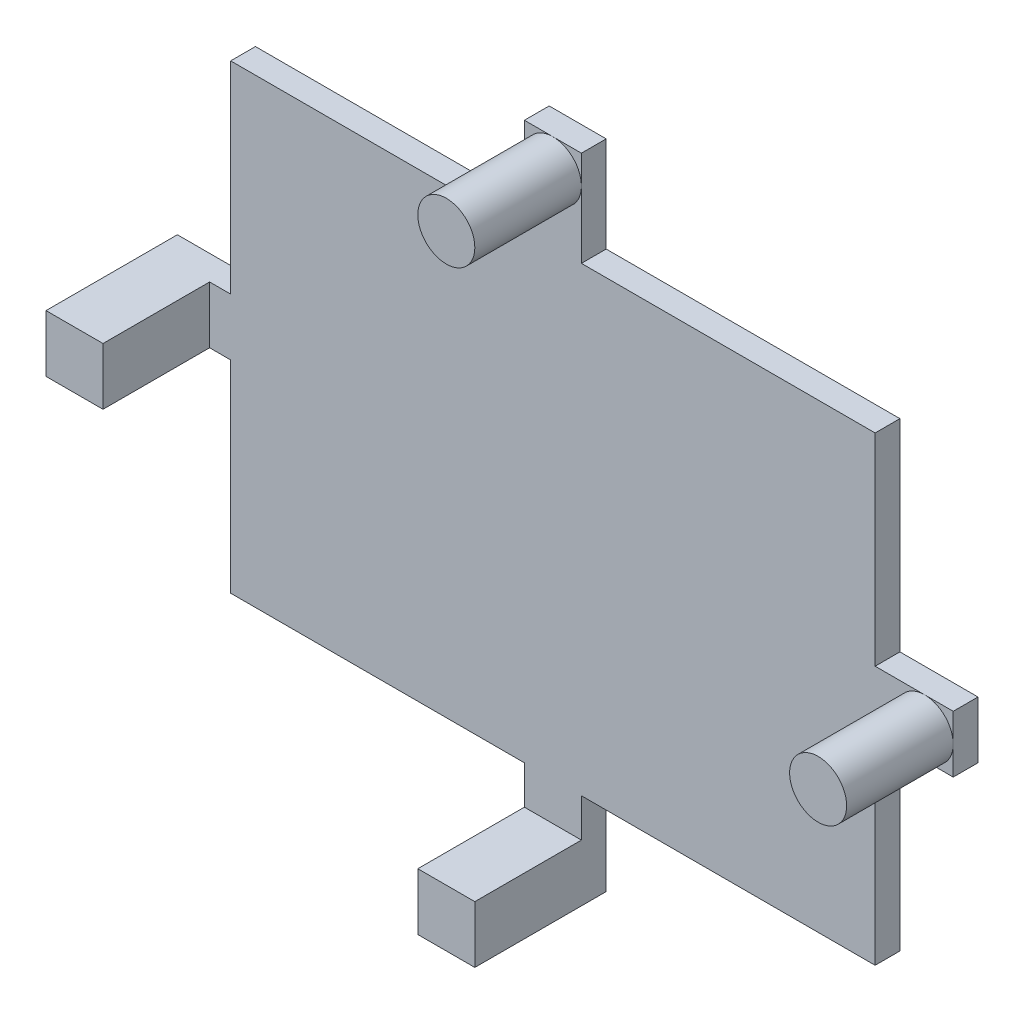
ISO-10303-21;
HEADER;
FILE_DESCRIPTION(('STEP AP214'),'2;1');
FILE_NAME('part.step','',(''),(''),'','','');
FILE_SCHEMA(('AUTOMOTIVE_DESIGN { 1 0 10303 214 1 1 1 1 }'));
ENDSEC;
DATA;
#1=APPLICATION_CONTEXT('core data for automotive mechanical design processes');
#2=APPLICATION_PROTOCOL_DEFINITION('international standard','automotive_design',2000,#1);
#3=PRODUCT_CONTEXT('',#1,'mechanical');
#4=PRODUCT('Part','Part','',(#3));
#5=PRODUCT_RELATED_PRODUCT_CATEGORY('part','',(#4));
#6=PRODUCT_DEFINITION_FORMATION('','',#4);
#7=PRODUCT_DEFINITION_CONTEXT('part definition',#1,'design');
#8=PRODUCT_DEFINITION('design','',#6,#7);
#9=PRODUCT_DEFINITION_SHAPE('','',#8);
#10=(LENGTH_UNIT() NAMED_UNIT(*) SI_UNIT(.MILLI.,.METRE.));
#11=(NAMED_UNIT(*) PLANE_ANGLE_UNIT() SI_UNIT($,.RADIAN.));
#12=(NAMED_UNIT(*) SI_UNIT($,.STERADIAN.) SOLID_ANGLE_UNIT());
#13=UNCERTAINTY_MEASURE_WITH_UNIT(LENGTH_MEASURE(1.E-05),#10,'distance_accuracy_value','');
#14=(GEOMETRIC_REPRESENTATION_CONTEXT(3) GLOBAL_UNCERTAINTY_ASSIGNED_CONTEXT((#13)) GLOBAL_UNIT_ASSIGNED_CONTEXT((#10,
#11,#12)) REPRESENTATION_CONTEXT('',''));
#15=CARTESIAN_POINT('',(0.,0.,0.));
#16=DIRECTION('',(0.,0.,1.));
#17=DIRECTION('',(1.,0.,0.));
#18=AXIS2_PLACEMENT_3D('',#15,#16,#17);
#19=CARTESIAN_POINT('',(-65.,-46.5,5.));
#20=DIRECTION('',(1.,0.,0.));
#21=DIRECTION('',(0.,0.,-1.));
#22=AXIS2_PLACEMENT_3D('',#19,#20,#21);
#23=PLANE('',#22);
#24=DIRECTION('',(0.,0.,-1.));
#25=VECTOR('',#24,1.);
#26=CARTESIAN_POINT('',(-65.,5.74999999999999,27.4234809964912));
#27=LINE('',#26,#25);
#28=CARTESIAN_POINT('',(-65.,5.74999999999998,5.));
#29=VERTEX_POINT('',#28);
#30=CARTESIAN_POINT('',(-65.,5.74999999999999,0.));
#31=VERTEX_POINT('',#30);
#32=EDGE_CURVE('E68',#29,#31,#27,.T.);
#33=ORIENTED_EDGE('',*,*,#32,.F.);
#34=DIRECTION('',(0.,-1.,0.));
#35=VECTOR('',#34,1.);
#36=CARTESIAN_POINT('',(-65.,-46.5,5.));
#37=LINE('',#36,#35);
#38=CARTESIAN_POINT('',(-65.,46.5,5.));
#39=VERTEX_POINT('',#38);
#40=EDGE_CURVE('E434',#39,#29,#37,.T.);
#41=ORIENTED_EDGE('',*,*,#40,.F.);
#42=DIRECTION('',(0.,0.,-1.));
#43=VECTOR('',#42,1.);
#44=CARTESIAN_POINT('',(-65.,46.5,5.));
#45=LINE('',#44,#43);
#46=CARTESIAN_POINT('',(-65.,46.5,0.));
#47=VERTEX_POINT('',#46);
#48=EDGE_CURVE('E464',#39,#47,#45,.T.);
#49=ORIENTED_EDGE('',*,*,#48,.T.);
#50=DIRECTION('',(0.,-1.,0.));
#51=VECTOR('',#50,1.);
#52=CARTESIAN_POINT('',(-65.,-46.5,0.));
#53=LINE('',#52,#51);
#54=EDGE_CURVE('E451',#47,#31,#53,.T.);
#55=ORIENTED_EDGE('',*,*,#54,.T.);
#56=EDGE_LOOP('',(#33,#41,#49,#55));
#57=FACE_BOUND('',#56,.T.);
#58=ADVANCED_FACE('F41',(#57),#23,.F.);
#59=CARTESIAN_POINT('',(-65.,-46.5,5.));
#60=DIRECTION('',(0.,1.,0.));
#61=DIRECTION('',(0.,0.,1.));
#62=AXIS2_PLACEMENT_3D('',#59,#60,#61);
#63=PLANE('',#62);
#64=DIRECTION('',(0.,0.,-1.));
#65=VECTOR('',#64,1.);
#66=CARTESIAN_POINT('',(-5.74999999999999,-46.5,27.4234809964912));
#67=LINE('',#66,#65);
#68=CARTESIAN_POINT('',(-5.74999999999999,-46.5,5.));
#69=VERTEX_POINT('',#68);
#70=CARTESIAN_POINT('',(-5.74999999999999,-46.5,0.));
#71=VERTEX_POINT('',#70);
#72=EDGE_CURVE('E282',#69,#71,#67,.T.);
#73=ORIENTED_EDGE('',*,*,#72,.F.);
#74=DIRECTION('',(1.,0.,0.));
#75=VECTOR('',#74,1.);
#76=CARTESIAN_POINT('',(-65.,-46.5,5.));
#77=LINE('',#76,#75);
#78=CARTESIAN_POINT('',(-65.,-46.5,5.));
#79=VERTEX_POINT('',#78);
#80=EDGE_CURVE('E438',#79,#69,#77,.T.);
#81=ORIENTED_EDGE('',*,*,#80,.F.);
#82=DIRECTION('',(0.,0.,-1.));
#83=VECTOR('',#82,1.);
#84=CARTESIAN_POINT('',(-65.,-46.5,5.));
#85=LINE('',#84,#83);
#86=CARTESIAN_POINT('',(-65.,-46.5,0.));
#87=VERTEX_POINT('',#86);
#88=EDGE_CURVE('E461',#79,#87,#85,.T.);
#89=ORIENTED_EDGE('',*,*,#88,.T.);
#90=DIRECTION('',(1.,0.,0.));
#91=VECTOR('',#90,1.);
#92=CARTESIAN_POINT('',(-65.,-46.5,0.));
#93=LINE('',#92,#91);
#94=EDGE_CURVE('E455',#87,#71,#93,.T.);
#95=ORIENTED_EDGE('',*,*,#94,.T.);
#96=EDGE_LOOP('',(#73,#81,#89,#95));
#97=FACE_BOUND('',#96,.T.);
#98=ADVANCED_FACE('F547',(#97),#63,.F.);
#99=CARTESIAN_POINT('',(0.,0.,5.));
#100=DIRECTION('',(0.,0.,-1.));
#101=DIRECTION('',(-1.,0.,0.));
#102=AXIS2_PLACEMENT_3D('',#99,#100,#101);
#103=PLANE('',#102);
#104=CARTESIAN_POINT('',(75.,0.,5.));
#105=DIRECTION('',(0.,0.,1.));
#106=DIRECTION('',(1.,0.,0.));
#107=AXIS2_PLACEMENT_3D('',#104,#105,#106);
#108=CIRCLE('',#107,5.74999999999999);
#109=CARTESIAN_POINT('',(75.,-5.74999999999999,5.));
#110=VERTEX_POINT('',#109);
#111=CARTESIAN_POINT('',(80.75,0.,5.));
#112=VERTEX_POINT('',#111);
#113=EDGE_CURVE('E336',#110,#112,#108,.T.);
#114=ORIENTED_EDGE('',*,*,#113,.F.);
#115=DIRECTION('',(-1.,0.,0.));
#116=VECTOR('',#115,1.);
#117=CARTESIAN_POINT('',(0.,-5.74999999999999,5.));
#118=LINE('',#117,#116);
#119=CARTESIAN_POINT('',(80.75,-5.74999999999999,5.));
#120=VERTEX_POINT('',#119);
#121=EDGE_CURVE('E355',#120,#110,#118,.T.);
#122=ORIENTED_EDGE('',*,*,#121,.F.);
#123=DIRECTION('',(0.,1.,0.));
#124=VECTOR('',#123,1.);
#125=CARTESIAN_POINT('',(80.75,0.,5.));
#126=LINE('',#125,#124);
#127=EDGE_CURVE('E365',#120,#112,#126,.T.);
#128=ORIENTED_EDGE('',*,*,#127,.T.);
#129=EDGE_LOOP('',(#114,#122,#128));
#130=FACE_BOUND('',#129,.T.);
#131=ADVANCED_FACE('F520',(#130),#103,.F.);
#132=CARTESIAN_POINT('',(75.,5.74999999999999,5.));
#133=VERTEX_POINT('',#132);
#134=EDGE_CURVE('E330',#112,#133,#108,.T.);
#135=ORIENTED_EDGE('',*,*,#134,.F.);
#136=CARTESIAN_POINT('',(80.75,5.74999999999999,5.));
#137=VERTEX_POINT('',#136);
#138=EDGE_CURVE('E344',#112,#137,#126,.T.);
#139=ORIENTED_EDGE('',*,*,#138,.T.);
#140=DIRECTION('',(-1.,0.,0.));
#141=VECTOR('',#140,1.);
#142=CARTESIAN_POINT('',(0.,5.74999999999999,5.));
#143=LINE('',#142,#141);
#144=EDGE_CURVE('E360',#137,#133,#143,.T.);
#145=ORIENTED_EDGE('',*,*,#144,.T.);
#146=EDGE_LOOP('',(#135,#139,#145));
#147=FACE_BOUND('',#146,.T.);
#148=ADVANCED_FACE('F529',(#147),#103,.F.);
#149=CARTESIAN_POINT('',(65.,-46.5,5.));
#150=DIRECTION('',(-1.,0.,0.));
#151=DIRECTION('',(0.,0.,1.));
#152=AXIS2_PLACEMENT_3D('',#149,#150,#151);
#153=PLANE('',#152);
#154=DIRECTION('',(0.,0.,-1.));
#155=VECTOR('',#154,1.);
#156=CARTESIAN_POINT('',(65.,-5.74999999999999,27.4234809964912));
#157=LINE('',#156,#155);
#158=CARTESIAN_POINT('',(65.,-5.75000000000001,5.));
#159=VERTEX_POINT('',#158);
#160=CARTESIAN_POINT('',(65.,-5.74999999999999,0.));
#161=VERTEX_POINT('',#160);
#162=EDGE_CURVE('E358',#159,#161,#157,.T.);
#163=ORIENTED_EDGE('',*,*,#162,.F.);
#164=DIRECTION('',(0.,1.,0.));
#165=VECTOR('',#164,1.);
#166=CARTESIAN_POINT('',(65.,-46.5,5.));
#167=LINE('',#166,#165);
#168=CARTESIAN_POINT('',(65.,-46.5,5.));
#169=VERTEX_POINT('',#168);
#170=EDGE_CURVE('E424',#169,#159,#167,.T.);
#171=ORIENTED_EDGE('',*,*,#170,.F.);
#172=DIRECTION('',(0.,0.,-1.));
#173=VECTOR('',#172,1.);
#174=CARTESIAN_POINT('',(65.,-46.5,5.));
#175=LINE('',#174,#173);
#176=CARTESIAN_POINT('',(65.,-46.5,0.));
#177=VERTEX_POINT('',#176);
#178=EDGE_CURVE('E442',#169,#177,#175,.T.);
#179=ORIENTED_EDGE('',*,*,#178,.T.);
#180=DIRECTION('',(0.,1.,0.));
#181=VECTOR('',#180,1.);
#182=CARTESIAN_POINT('',(65.,-46.5,0.));
#183=LINE('',#182,#181);
#184=EDGE_CURVE('E443',#177,#161,#183,.T.);
#185=ORIENTED_EDGE('',*,*,#184,.T.);
#186=EDGE_LOOP('',(#163,#171,#179,#185));
#187=FACE_BOUND('',#186,.T.);
#188=ADVANCED_FACE('F574',(#187),#153,.F.);
#189=CARTESIAN_POINT('',(0.,60.,5.));
#190=DIRECTION('',(0.,0.,1.));
#191=DIRECTION('',(1.,0.,0.));
#192=AXIS2_PLACEMENT_3D('',#189,#190,#191);
#193=CIRCLE('',#192,5.75);
#194=CARTESIAN_POINT('',(5.75,60.,5.));
#195=VERTEX_POINT('',#194);
#196=CARTESIAN_POINT('',(0.,65.75,5.));
#197=VERTEX_POINT('',#196);
#198=EDGE_CURVE('E53',#195,#197,#193,.T.);
#199=ORIENTED_EDGE('',*,*,#198,.F.);
#200=DIRECTION('',(0.,-1.,0.));
#201=VECTOR('',#200,1.);
#202=CARTESIAN_POINT('',(5.75000000000002,0.,5.));
#203=LINE('',#202,#201);
#204=CARTESIAN_POINT('',(5.75000000000002,65.75,5.));
#205=VERTEX_POINT('',#204);
#206=EDGE_CURVE('E400',#205,#195,#203,.T.);
#207=ORIENTED_EDGE('',*,*,#206,.F.);
#208=DIRECTION('',(-1.,0.,0.));
#209=VECTOR('',#208,1.);
#210=CARTESIAN_POINT('',(0.,65.75,5.));
#211=LINE('',#210,#209);
#212=EDGE_CURVE('E411',#205,#197,#211,.T.);
#213=ORIENTED_EDGE('',*,*,#212,.T.);
#214=EDGE_LOOP('',(#199,#207,#213));
#215=FACE_BOUND('',#214,.T.);
#216=ADVANCED_FACE('F579',(#215),#103,.F.);
#217=CARTESIAN_POINT('',(-5.74999999999999,60.,5.));
#218=VERTEX_POINT('',#217);
#219=EDGE_CURVE('E11',#197,#218,#193,.T.);
#220=ORIENTED_EDGE('',*,*,#219,.F.);
#221=CARTESIAN_POINT('',(-5.74999999999999,65.75,5.));
#222=VERTEX_POINT('',#221);
#223=EDGE_CURVE('E389',#197,#222,#211,.T.);
#224=ORIENTED_EDGE('',*,*,#223,.T.);
#225=DIRECTION('',(0.,-1.,0.));
#226=VECTOR('',#225,1.);
#227=CARTESIAN_POINT('',(-5.74999999999999,0.,5.));
#228=LINE('',#227,#226);
#229=EDGE_CURVE('E405',#222,#218,#228,.T.);
#230=ORIENTED_EDGE('',*,*,#229,.T.);
#231=EDGE_LOOP('',(#220,#224,#230));
#232=FACE_BOUND('',#231,.T.);
#233=ADVANCED_FACE('F488',(#232),#103,.F.);
#234=CARTESIAN_POINT('',(-65.,46.5,5.));
#235=DIRECTION('',(0.,-1.,0.));
#236=DIRECTION('',(0.,0.,-1.));
#237=AXIS2_PLACEMENT_3D('',#234,#235,#236);
#238=PLANE('',#237);
#239=DIRECTION('',(0.,0.,-1.));
#240=VECTOR('',#239,1.);
#241=CARTESIAN_POINT('',(5.75000000000002,46.5,27.4234809964912));
#242=LINE('',#241,#240);
#243=CARTESIAN_POINT('',(5.75000000000002,46.5,5.));
#244=VERTEX_POINT('',#243);
#245=CARTESIAN_POINT('',(5.75000000000002,46.5,0.));
#246=VERTEX_POINT('',#245);
#247=EDGE_CURVE('E403',#244,#246,#242,.T.);
#248=ORIENTED_EDGE('',*,*,#247,.F.);
#249=DIRECTION('',(-1.,0.,0.));
#250=VECTOR('',#249,1.);
#251=CARTESIAN_POINT('',(-65.,46.5,5.));
#252=LINE('',#251,#250);
#253=CARTESIAN_POINT('',(65.,46.5,5.));
#254=VERTEX_POINT('',#253);
#255=EDGE_CURVE('E430',#254,#244,#252,.T.);
#256=ORIENTED_EDGE('',*,*,#255,.F.);
#257=DIRECTION('',(0.,0.,-1.));
#258=VECTOR('',#257,1.);
#259=CARTESIAN_POINT('',(65.,46.5,5.));
#260=LINE('',#259,#258);
#261=CARTESIAN_POINT('',(65.,46.5,0.));
#262=VERTEX_POINT('',#261);
#263=EDGE_CURVE('E45',#254,#262,#260,.T.);
#264=ORIENTED_EDGE('',*,*,#263,.T.);
#265=DIRECTION('',(-1.,0.,0.));
#266=VECTOR('',#265,1.);
#267=CARTESIAN_POINT('',(-65.,46.5,0.));
#268=LINE('',#267,#266);
#269=EDGE_CURVE('E447',#262,#246,#268,.T.);
#270=ORIENTED_EDGE('',*,*,#269,.T.);
#271=EDGE_LOOP('',(#248,#256,#264,#270));
#272=FACE_BOUND('',#271,.T.);
#273=ADVANCED_FACE('F570',(#272),#238,.F.);
#274=CARTESIAN_POINT('',(65.,5.74999999999998,5.));
#275=VERTEX_POINT('',#274);
#276=EDGE_CURVE('E429',#275,#254,#167,.T.);
#277=ORIENTED_EDGE('',*,*,#276,.F.);
#278=DIRECTION('',(0.,0.,-1.));
#279=VECTOR('',#278,1.);
#280=CARTESIAN_POINT('',(65.,5.74999999999999,27.4234809964912));
#281=LINE('',#280,#279);
#282=CARTESIAN_POINT('',(65.,5.74999999999998,0.));
#283=VERTEX_POINT('',#282);
#284=EDGE_CURVE('E354',#275,#283,#281,.T.);
#285=ORIENTED_EDGE('',*,*,#284,.T.);
#286=EDGE_CURVE('E409',#283,#262,#183,.T.);
#287=ORIENTED_EDGE('',*,*,#286,.T.);
#288=ORIENTED_EDGE('',*,*,#263,.F.);
#289=EDGE_LOOP('',(#277,#285,#287,#288));
#290=FACE_BOUND('',#289,.T.);
#291=ADVANCED_FACE('F43',(#290),#153,.F.);
#292=CARTESIAN_POINT('',(-5.74999999999999,46.5,5.));
#293=VERTEX_POINT('',#292);
#294=EDGE_CURVE('E428',#293,#39,#252,.T.);
#295=ORIENTED_EDGE('',*,*,#294,.F.);
#296=DIRECTION('',(0.,0.,-1.));
#297=VECTOR('',#296,1.);
#298=CARTESIAN_POINT('',(-5.74999999999999,46.5,27.4234809964912));
#299=LINE('',#298,#297);
#300=CARTESIAN_POINT('',(-5.74999999999999,46.5,0.));
#301=VERTEX_POINT('',#300);
#302=EDGE_CURVE('E399',#293,#301,#299,.T.);
#303=ORIENTED_EDGE('',*,*,#302,.T.);
#304=EDGE_CURVE('E446',#301,#47,#268,.T.);
#305=ORIENTED_EDGE('',*,*,#304,.T.);
#306=ORIENTED_EDGE('',*,*,#48,.F.);
#307=EDGE_LOOP('',(#295,#303,#305,#306));
#308=FACE_BOUND('',#307,.T.);
#309=ADVANCED_FACE('F556',(#308),#238,.F.);
#310=CARTESIAN_POINT('',(-65.,-5.75000000000001,5.));
#311=VERTEX_POINT('',#310);
#312=EDGE_CURVE('E60',#311,#79,#37,.T.);
#313=ORIENTED_EDGE('',*,*,#312,.F.);
#314=DIRECTION('',(0.,0.,-1.));
#315=VECTOR('',#314,1.);
#316=CARTESIAN_POINT('',(-65.,-5.74999999999999,27.4234809964912));
#317=LINE('',#316,#315);
#318=CARTESIAN_POINT('',(-65.,-5.75000000000001,0.));
#319=VERTEX_POINT('',#318);
#320=EDGE_CURVE('E250',#311,#319,#317,.T.);
#321=ORIENTED_EDGE('',*,*,#320,.T.);
#322=EDGE_CURVE('E450',#319,#87,#53,.T.);
#323=ORIENTED_EDGE('',*,*,#322,.T.);
#324=ORIENTED_EDGE('',*,*,#88,.F.);
#325=EDGE_LOOP('',(#313,#321,#323,#324));
#326=FACE_BOUND('',#325,.T.);
#327=ADVANCED_FACE('F542',(#326),#23,.F.);
#328=CARTESIAN_POINT('',(5.75000000000002,-46.5,5.));
#329=VERTEX_POINT('',#328);
#330=EDGE_CURVE('E437',#329,#169,#77,.T.);
#331=ORIENTED_EDGE('',*,*,#330,.F.);
#332=DIRECTION('',(0.,0.,-1.));
#333=VECTOR('',#332,1.);
#334=CARTESIAN_POINT('',(5.75000000000002,-46.5,27.4234809964912));
#335=LINE('',#334,#333);
#336=CARTESIAN_POINT('',(5.75000000000002,-46.5,0.));
#337=VERTEX_POINT('',#336);
#338=EDGE_CURVE('E306',#329,#337,#335,.T.);
#339=ORIENTED_EDGE('',*,*,#338,.T.);
#340=EDGE_CURVE('E454',#337,#177,#93,.T.);
#341=ORIENTED_EDGE('',*,*,#340,.T.);
#342=ORIENTED_EDGE('',*,*,#178,.F.);
#343=EDGE_LOOP('',(#331,#339,#341,#342));
#344=FACE_BOUND('',#343,.T.);
#345=ADVANCED_FACE('F563',(#344),#63,.F.);
#346=DIRECTION('',(-1.,0.,0.));
#347=VECTOR('',#346,1.);
#348=CARTESIAN_POINT('',(0.,5.74999999999999,5.));
#349=LINE('',#348,#347);
#350=CARTESIAN_POINT('',(-69.25,5.74999999999999,5.));
#351=VERTEX_POINT('',#350);
#352=EDGE_CURVE('E244',#29,#351,#349,.T.);
#353=ORIENTED_EDGE('',*,*,#352,.T.);
#354=DIRECTION('',(0.,-1.,0.));
#355=VECTOR('',#354,1.);
#356=CARTESIAN_POINT('',(-69.25,5.74999999999999,5.));
#357=LINE('',#356,#355);
#358=CARTESIAN_POINT('',(-69.25,-5.75000000000001,5.));
#359=VERTEX_POINT('',#358);
#360=EDGE_CURVE('E229',#351,#359,#357,.T.);
#361=ORIENTED_EDGE('',*,*,#360,.T.);
#362=DIRECTION('',(-1.,0.,0.));
#363=VECTOR('',#362,1.);
#364=CARTESIAN_POINT('',(0.,-5.74999999999999,5.));
#365=LINE('',#364,#363);
#366=EDGE_CURVE('E241',#311,#359,#365,.T.);
#367=ORIENTED_EDGE('',*,*,#366,.F.);
#368=ORIENTED_EDGE('',*,*,#312,.T.);
#369=ORIENTED_EDGE('',*,*,#80,.T.);
#370=DIRECTION('',(0.,-1.,0.));
#371=VECTOR('',#370,1.);
#372=CARTESIAN_POINT('',(-5.74999999999999,0.,5.));
#373=LINE('',#372,#371);
#374=CARTESIAN_POINT('',(-5.74999999999999,-54.25,5.));
#375=VERTEX_POINT('',#374);
#376=EDGE_CURVE('E301',#69,#375,#373,.T.);
#377=ORIENTED_EDGE('',*,*,#376,.T.);
#378=DIRECTION('',(1.,0.,0.));
#379=VECTOR('',#378,1.);
#380=CARTESIAN_POINT('',(-5.74999999999999,-54.25,5.));
#381=LINE('',#380,#379);
#382=CARTESIAN_POINT('',(5.75000000000001,-54.25,5.));
#383=VERTEX_POINT('',#382);
#384=EDGE_CURVE('E278',#375,#383,#381,.T.);
#385=ORIENTED_EDGE('',*,*,#384,.T.);
#386=DIRECTION('',(0.,-1.,0.));
#387=VECTOR('',#386,1.);
#388=CARTESIAN_POINT('',(5.75000000000002,0.,5.));
#389=LINE('',#388,#387);
#390=EDGE_CURVE('E312',#329,#383,#389,.T.);
#391=ORIENTED_EDGE('',*,*,#390,.F.);
#392=ORIENTED_EDGE('',*,*,#330,.T.);
#393=ORIENTED_EDGE('',*,*,#170,.T.);
#394=EDGE_CURVE('E359',#110,#159,#118,.T.);
#395=ORIENTED_EDGE('',*,*,#394,.F.);
#396=EDGE_CURVE('E335',#133,#110,#108,.T.);
#397=ORIENTED_EDGE('',*,*,#396,.F.);
#398=EDGE_CURVE('E364',#133,#275,#143,.T.);
#399=ORIENTED_EDGE('',*,*,#398,.T.);
#400=ORIENTED_EDGE('',*,*,#276,.T.);
#401=ORIENTED_EDGE('',*,*,#255,.T.);
#402=EDGE_CURVE('E404',#195,#244,#203,.T.);
#403=ORIENTED_EDGE('',*,*,#402,.F.);
#404=EDGE_CURVE('E51',#218,#195,#193,.T.);
#405=ORIENTED_EDGE('',*,*,#404,.F.);
#406=EDGE_CURVE('E410',#218,#293,#228,.T.);
#407=ORIENTED_EDGE('',*,*,#406,.T.);
#408=ORIENTED_EDGE('',*,*,#294,.T.);
#409=ORIENTED_EDGE('',*,*,#40,.T.);
#410=EDGE_LOOP('',(#353,#361,#367,#368,#369,#377,#385,#391,#392,#393,#395,#397,#399,#400,#401,
#403,#405,#407,#408,#409));
#411=FACE_BOUND('',#410,.T.);
#412=ADVANCED_FACE('F240',(#411),#103,.F.);
#413=CARTESIAN_POINT('',(0.,0.,0.));
#414=DIRECTION('',(0.,0.,-1.));
#415=DIRECTION('',(-1.,0.,0.));
#416=AXIS2_PLACEMENT_3D('',#413,#414,#415);
#417=PLANE('',#416);
#418=ORIENTED_EDGE('',*,*,#184,.F.);
#419=ORIENTED_EDGE('',*,*,#340,.F.);
#420=DIRECTION('',(0.,-1.,0.));
#421=VECTOR('',#420,1.);
#422=CARTESIAN_POINT('',(5.75000000000002,0.,0.));
#423=LINE('',#422,#421);
#424=CARTESIAN_POINT('',(5.75000000000002,-65.75,0.));
#425=VERTEX_POINT('',#424);
#426=EDGE_CURVE('E302',#337,#425,#423,.T.);
#427=ORIENTED_EDGE('',*,*,#426,.T.);
#428=DIRECTION('',(-1.,0.,0.));
#429=VECTOR('',#428,1.);
#430=CARTESIAN_POINT('',(0.,-65.75,0.));
#431=LINE('',#430,#429);
#432=CARTESIAN_POINT('',(-5.74999999999999,-65.75,0.));
#433=VERTEX_POINT('',#432);
#434=EDGE_CURVE('E297',#425,#433,#431,.T.);
#435=ORIENTED_EDGE('',*,*,#434,.T.);
#436=DIRECTION('',(0.,-1.,0.));
#437=VECTOR('',#436,1.);
#438=CARTESIAN_POINT('',(-5.74999999999999,0.,0.));
#439=LINE('',#438,#437);
#440=EDGE_CURVE('E307',#71,#433,#439,.T.);
#441=ORIENTED_EDGE('',*,*,#440,.F.);
#442=ORIENTED_EDGE('',*,*,#94,.F.);
#443=ORIENTED_EDGE('',*,*,#322,.F.);
#444=DIRECTION('',(-1.,0.,0.));
#445=VECTOR('',#444,1.);
#446=CARTESIAN_POINT('',(0.,-5.74999999999999,0.));
#447=LINE('',#446,#445);
#448=CARTESIAN_POINT('',(-80.75,-5.74999999999999,0.));
#449=VERTEX_POINT('',#448);
#450=EDGE_CURVE('E262',#319,#449,#447,.T.);
#451=ORIENTED_EDGE('',*,*,#450,.T.);
#452=DIRECTION('',(0.,1.,0.));
#453=VECTOR('',#452,1.);
#454=CARTESIAN_POINT('',(-80.75,0.,0.));
#455=LINE('',#454,#453);
#456=CARTESIAN_POINT('',(-80.75,5.74999999999999,0.));
#457=VERTEX_POINT('',#456);
#458=EDGE_CURVE('E270',#449,#457,#455,.T.);
#459=ORIENTED_EDGE('',*,*,#458,.T.);
#460=DIRECTION('',(-1.,0.,0.));
#461=VECTOR('',#460,1.);
#462=CARTESIAN_POINT('',(0.,5.74999999999999,0.));
#463=LINE('',#462,#461);
#464=EDGE_CURVE('E258',#31,#457,#463,.T.);
#465=ORIENTED_EDGE('',*,*,#464,.F.);
#466=ORIENTED_EDGE('',*,*,#54,.F.);
#467=ORIENTED_EDGE('',*,*,#304,.F.);
#468=DIRECTION('',(0.,-1.,0.));
#469=VECTOR('',#468,1.);
#470=CARTESIAN_POINT('',(-5.74999999999999,0.,0.));
#471=LINE('',#470,#469);
#472=CARTESIAN_POINT('',(-5.74999999999999,65.75,0.));
#473=VERTEX_POINT('',#472);
#474=EDGE_CURVE('E395',#473,#301,#471,.T.);
#475=ORIENTED_EDGE('',*,*,#474,.F.);
#476=DIRECTION('',(-1.,0.,0.));
#477=VECTOR('',#476,1.);
#478=CARTESIAN_POINT('',(0.,65.75,0.));
#479=LINE('',#478,#477);
#480=CARTESIAN_POINT('',(5.75000000000002,65.75,0.));
#481=VERTEX_POINT('',#480);
#482=EDGE_CURVE('E390',#481,#473,#479,.T.);
#483=ORIENTED_EDGE('',*,*,#482,.F.);
#484=DIRECTION('',(0.,-1.,0.));
#485=VECTOR('',#484,1.);
#486=CARTESIAN_POINT('',(5.75000000000002,0.,0.));
#487=LINE('',#486,#485);
#488=EDGE_CURVE('E385',#481,#246,#487,.T.);
#489=ORIENTED_EDGE('',*,*,#488,.T.);
#490=ORIENTED_EDGE('',*,*,#269,.F.);
#491=ORIENTED_EDGE('',*,*,#286,.F.);
#492=DIRECTION('',(-1.,0.,0.));
#493=VECTOR('',#492,1.);
#494=CARTESIAN_POINT('',(0.,5.74999999999999,0.));
#495=LINE('',#494,#493);
#496=CARTESIAN_POINT('',(80.75,5.74999999999999,0.));
#497=VERTEX_POINT('',#496);
#498=EDGE_CURVE('E350',#497,#283,#495,.T.);
#499=ORIENTED_EDGE('',*,*,#498,.F.);
#500=DIRECTION('',(0.,1.,0.));
#501=VECTOR('',#500,1.);
#502=CARTESIAN_POINT('',(80.75,0.,0.));
#503=LINE('',#502,#501);
#504=CARTESIAN_POINT('',(80.75,-5.74999999999999,0.));
#505=VERTEX_POINT('',#504);
#506=EDGE_CURVE('E345',#505,#497,#503,.T.);
#507=ORIENTED_EDGE('',*,*,#506,.F.);
#508=DIRECTION('',(-1.,0.,0.));
#509=VECTOR('',#508,1.);
#510=CARTESIAN_POINT('',(0.,-5.74999999999999,0.));
#511=LINE('',#510,#509);
#512=EDGE_CURVE('E340',#505,#161,#511,.T.);
#513=ORIENTED_EDGE('',*,*,#512,.T.);
#514=EDGE_LOOP('',(#418,#419,#427,#435,#441,#442,#443,#451,#459,#465,#466,#467,#475,#483,#489,
#490,#491,#499,#507,#513));
#515=FACE_BOUND('',#514,.T.);
#516=ADVANCED_FACE('F500',(#515),#417,.T.);
#517=CARTESIAN_POINT('',(-5.74999999999999,0.,27.4234809964912));
#518=DIRECTION('',(1.,0.,0.));
#519=DIRECTION('',(0.,0.,-1.));
#520=AXIS2_PLACEMENT_3D('',#517,#518,#519);
#521=PLANE('',#520);
#522=ORIENTED_EDGE('',*,*,#229,.F.);
#523=DIRECTION('',(0.,0.,-1.));
#524=VECTOR('',#523,1.);
#525=CARTESIAN_POINT('',(-5.74999999999999,65.75,27.4234809964912));
#526=LINE('',#525,#524);
#527=EDGE_CURVE('E381',#222,#473,#526,.T.);
#528=ORIENTED_EDGE('',*,*,#527,.T.);
#529=ORIENTED_EDGE('',*,*,#474,.T.);
#530=ORIENTED_EDGE('',*,*,#302,.F.);
#531=ORIENTED_EDGE('',*,*,#406,.F.);
#532=EDGE_LOOP('',(#522,#528,#529,#530,#531));
#533=FACE_BOUND('',#532,.T.);
#534=ADVANCED_FACE('F485',(#533),#521,.F.);
#535=CARTESIAN_POINT('',(5.75000000000002,0.,27.4234809964912));
#536=DIRECTION('',(1.,0.,0.));
#537=DIRECTION('',(0.,0.,-1.));
#538=AXIS2_PLACEMENT_3D('',#535,#536,#537);
#539=PLANE('',#538);
#540=DIRECTION('',(0.,0.,-1.));
#541=VECTOR('',#540,1.);
#542=CARTESIAN_POINT('',(5.75000000000002,65.75,27.4234809964912));
#543=LINE('',#542,#541);
#544=EDGE_CURVE('E394',#205,#481,#543,.T.);
#545=ORIENTED_EDGE('',*,*,#544,.F.);
#546=ORIENTED_EDGE('',*,*,#206,.T.);
#547=ORIENTED_EDGE('',*,*,#402,.T.);
#548=ORIENTED_EDGE('',*,*,#247,.T.);
#549=ORIENTED_EDGE('',*,*,#488,.F.);
#550=EDGE_LOOP('',(#545,#546,#547,#548,#549));
#551=FACE_BOUND('',#550,.T.);
#552=ADVANCED_FACE('F584',(#551),#539,.T.);
#553=CARTESIAN_POINT('',(0.,65.75,27.4234809964912));
#554=DIRECTION('',(0.,-1.,0.));
#555=DIRECTION('',(0.,0.,-1.));
#556=AXIS2_PLACEMENT_3D('',#553,#554,#555);
#557=PLANE('',#556);
#558=ORIENTED_EDGE('',*,*,#212,.F.);
#559=ORIENTED_EDGE('',*,*,#544,.T.);
#560=ORIENTED_EDGE('',*,*,#482,.T.);
#561=ORIENTED_EDGE('',*,*,#527,.F.);
#562=ORIENTED_EDGE('',*,*,#223,.F.);
#563=EDGE_LOOP('',(#558,#559,#560,#561,#562));
#564=FACE_BOUND('',#563,.T.);
#565=ADVANCED_FACE('F494',(#564),#557,.F.);
#566=CARTESIAN_POINT('',(0.,60.,26.5));
#567=DIRECTION('',(0.,0.,-1.));
#568=DIRECTION('',(-1.,0.,0.));
#569=AXIS2_PLACEMENT_3D('',#566,#567,#568);
#570=CYLINDRICAL_SURFACE('',#569,5.75);
#571=CARTESIAN_POINT('',(0.,60.,26.5));
#572=DIRECTION('',(0.,0.,1.));
#573=DIRECTION('',(1.,0.,0.));
#574=AXIS2_PLACEMENT_3D('',#571,#572,#573);
#575=CIRCLE('',#574,5.75);
#576=CARTESIAN_POINT('',(5.75,60.,26.5));
#577=VERTEX_POINT('',#576);
#578=EDGE_CURVE('E378',#577,#577,#575,.T.);
#579=ORIENTED_EDGE('',*,*,#578,.F.);
#580=EDGE_LOOP('',(#579));
#581=FACE_BOUND('',#580,.T.);
#582=ORIENTED_EDGE('',*,*,#198,.T.);
#583=ORIENTED_EDGE('',*,*,#219,.T.);
#584=ORIENTED_EDGE('',*,*,#404,.T.);
#585=EDGE_LOOP('',(#582,#583,#584));
#586=FACE_BOUND('',#585,.T.);
#587=ADVANCED_FACE('F477',(#581,#586),#570,.T.);
#588=CARTESIAN_POINT('',(0.,60.,26.5));
#589=DIRECTION('',(0.,0.,1.));
#590=DIRECTION('',(1.,0.,0.));
#591=AXIS2_PLACEMENT_3D('',#588,#589,#590);
#592=PLANE('',#591);
#593=ORIENTED_EDGE('',*,*,#578,.T.);
#594=EDGE_LOOP('',(#593));
#595=FACE_BOUND('',#594,.T.);
#596=ADVANCED_FACE('F639',(#595),#592,.T.);
#597=CARTESIAN_POINT('',(0.,5.74999999999999,27.4234809964912));
#598=DIRECTION('',(0.,-1.,0.));
#599=DIRECTION('',(0.,0.,-1.));
#600=AXIS2_PLACEMENT_3D('',#597,#598,#599);
#601=PLANE('',#600);
#602=ORIENTED_EDGE('',*,*,#144,.F.);
#603=DIRECTION('',(0.,0.,-1.));
#604=VECTOR('',#603,1.);
#605=CARTESIAN_POINT('',(80.75,5.74999999999999,27.4234809964912));
#606=LINE('',#605,#604);
#607=EDGE_CURVE('E334',#137,#497,#606,.T.);
#608=ORIENTED_EDGE('',*,*,#607,.T.);
#609=ORIENTED_EDGE('',*,*,#498,.T.);
#610=ORIENTED_EDGE('',*,*,#284,.F.);
#611=ORIENTED_EDGE('',*,*,#398,.F.);
#612=EDGE_LOOP('',(#602,#608,#609,#610,#611));
#613=FACE_BOUND('',#612,.T.);
#614=ADVANCED_FACE('F532',(#613),#601,.F.);
#615=CARTESIAN_POINT('',(0.,-5.74999999999999,27.4234809964912));
#616=DIRECTION('',(0.,-1.,0.));
#617=DIRECTION('',(0.,0.,-1.));
#618=AXIS2_PLACEMENT_3D('',#615,#616,#617);
#619=PLANE('',#618);
#620=DIRECTION('',(0.,0.,-1.));
#621=VECTOR('',#620,1.);
#622=CARTESIAN_POINT('',(80.75,-5.74999999999999,27.4234809964912));
#623=LINE('',#622,#621);
#624=EDGE_CURVE('E349',#120,#505,#623,.T.);
#625=ORIENTED_EDGE('',*,*,#624,.F.);
#626=ORIENTED_EDGE('',*,*,#121,.T.);
#627=ORIENTED_EDGE('',*,*,#394,.T.);
#628=ORIENTED_EDGE('',*,*,#162,.T.);
#629=ORIENTED_EDGE('',*,*,#512,.F.);
#630=EDGE_LOOP('',(#625,#626,#627,#628,#629));
#631=FACE_BOUND('',#630,.T.);
#632=ADVANCED_FACE('F588',(#631),#619,.T.);
#633=CARTESIAN_POINT('',(80.75,0.,27.4234809964912));
#634=DIRECTION('',(-1.,0.,0.));
#635=DIRECTION('',(0.,0.,1.));
#636=AXIS2_PLACEMENT_3D('',#633,#634,#635);
#637=PLANE('',#636);
#638=ORIENTED_EDGE('',*,*,#127,.F.);
#639=ORIENTED_EDGE('',*,*,#624,.T.);
#640=ORIENTED_EDGE('',*,*,#506,.T.);
#641=ORIENTED_EDGE('',*,*,#607,.F.);
#642=ORIENTED_EDGE('',*,*,#138,.F.);
#643=EDGE_LOOP('',(#638,#639,#640,#641,#642));
#644=FACE_BOUND('',#643,.T.);
#645=ADVANCED_FACE('F524',(#644),#637,.F.);
#646=CARTESIAN_POINT('',(75.,0.,26.5));
#647=DIRECTION('',(0.,0.,-1.));
#648=DIRECTION('',(-1.,0.,0.));
#649=AXIS2_PLACEMENT_3D('',#646,#647,#648);
#650=CYLINDRICAL_SURFACE('',#649,5.74999999999999);
#651=CARTESIAN_POINT('',(75.,0.,26.5));
#652=DIRECTION('',(0.,0.,1.));
#653=DIRECTION('',(1.,0.,0.));
#654=AXIS2_PLACEMENT_3D('',#651,#652,#653);
#655=CIRCLE('',#654,5.74999999999999);
#656=CARTESIAN_POINT('',(80.75,0.,26.5));
#657=VERTEX_POINT('',#656);
#658=EDGE_CURVE('E320',#657,#657,#655,.T.);
#659=ORIENTED_EDGE('',*,*,#658,.F.);
#660=EDGE_LOOP('',(#659));
#661=FACE_BOUND('',#660,.T.);
#662=ORIENTED_EDGE('',*,*,#134,.T.);
#663=ORIENTED_EDGE('',*,*,#396,.T.);
#664=ORIENTED_EDGE('',*,*,#113,.T.);
#665=EDGE_LOOP('',(#662,#663,#664));
#666=FACE_BOUND('',#665,.T.);
#667=ADVANCED_FACE('F517',(#661,#666),#650,.T.);
#668=CARTESIAN_POINT('',(75.,0.,26.5));
#669=DIRECTION('',(0.,0.,1.));
#670=DIRECTION('',(1.,0.,0.));
#671=AXIS2_PLACEMENT_3D('',#668,#669,#670);
#672=PLANE('',#671);
#673=ORIENTED_EDGE('',*,*,#658,.T.);
#674=EDGE_LOOP('',(#673));
#675=FACE_BOUND('',#674,.T.);
#676=ADVANCED_FACE('F626',(#675),#672,.T.);
#677=CARTESIAN_POINT('',(-5.74999999999999,0.,27.4234809964912));
#678=DIRECTION('',(1.,0.,0.));
#679=DIRECTION('',(0.,0.,-1.));
#680=AXIS2_PLACEMENT_3D('',#677,#678,#679);
#681=PLANE('',#680);
#682=ORIENTED_EDGE('',*,*,#376,.F.);
#683=ORIENTED_EDGE('',*,*,#72,.T.);
#684=ORIENTED_EDGE('',*,*,#440,.T.);
#685=DIRECTION('',(0.,0.,-1.));
#686=VECTOR('',#685,1.);
#687=CARTESIAN_POINT('',(-5.74999999999999,-65.75,27.4234809964912));
#688=LINE('',#687,#686);
#689=CARTESIAN_POINT('',(-5.74999999999999,-65.75,26.5));
#690=VERTEX_POINT('',#689);
#691=EDGE_CURVE('E311',#690,#433,#688,.T.);
#692=ORIENTED_EDGE('',*,*,#691,.F.);
#693=DIRECTION('',(0.,1.,0.));
#694=VECTOR('',#693,1.);
#695=CARTESIAN_POINT('',(-5.74999999999999,-65.75,26.5));
#696=LINE('',#695,#694);
#697=CARTESIAN_POINT('',(-5.74999999999999,-54.25,26.5));
#698=VERTEX_POINT('',#697);
#699=EDGE_CURVE('E275',#690,#698,#696,.T.);
#700=ORIENTED_EDGE('',*,*,#699,.T.);
#701=DIRECTION('',(0.,0.,-1.));
#702=VECTOR('',#701,1.);
#703=CARTESIAN_POINT('',(-5.74999999999999,-54.25,26.5));
#704=LINE('',#703,#702);
#705=EDGE_CURVE('E256',#698,#375,#704,.T.);
#706=ORIENTED_EDGE('',*,*,#705,.T.);
#707=EDGE_LOOP('',(#682,#683,#684,#692,#700,#706));
#708=FACE_BOUND('',#707,.T.);
#709=ADVANCED_FACE('F552',(#708),#681,.F.);
#710=CARTESIAN_POINT('',(0.,-65.75,27.4234809964912));
#711=DIRECTION('',(0.,-1.,0.));
#712=DIRECTION('',(0.,0.,-1.));
#713=AXIS2_PLACEMENT_3D('',#710,#711,#712);
#714=PLANE('',#713);
#715=DIRECTION('',(0.,0.,-1.));
#716=VECTOR('',#715,1.);
#717=CARTESIAN_POINT('',(5.75000000000002,-65.75,27.4234809964912));
#718=LINE('',#717,#716);
#719=CARTESIAN_POINT('',(5.75000000000001,-65.75,26.5));
#720=VERTEX_POINT('',#719);
#721=EDGE_CURVE('E316',#720,#425,#718,.T.);
#722=ORIENTED_EDGE('',*,*,#721,.F.);
#723=DIRECTION('',(1.,0.,0.));
#724=VECTOR('',#723,1.);
#725=CARTESIAN_POINT('',(-5.74999999999999,-65.75,26.5));
#726=LINE('',#725,#724);
#727=EDGE_CURVE('E287',#690,#720,#726,.T.);
#728=ORIENTED_EDGE('',*,*,#727,.F.);
#729=ORIENTED_EDGE('',*,*,#691,.T.);
#730=ORIENTED_EDGE('',*,*,#434,.F.);
#731=EDGE_LOOP('',(#722,#728,#729,#730));
#732=FACE_BOUND('',#731,.T.);
#733=ADVANCED_FACE('F602',(#732),#714,.T.);
#734=CARTESIAN_POINT('',(5.75000000000002,0.,27.4234809964912));
#735=DIRECTION('',(1.,0.,0.));
#736=DIRECTION('',(0.,0.,-1.));
#737=AXIS2_PLACEMENT_3D('',#734,#735,#736);
#738=PLANE('',#737);
#739=ORIENTED_EDGE('',*,*,#338,.F.);
#740=ORIENTED_EDGE('',*,*,#390,.T.);
#741=DIRECTION('',(0.,0.,-1.));
#742=VECTOR('',#741,1.);
#743=CARTESIAN_POINT('',(5.75000000000001,-54.25,26.5));
#744=LINE('',#743,#742);
#745=CARTESIAN_POINT('',(5.75000000000001,-54.25,26.5));
#746=VERTEX_POINT('',#745);
#747=EDGE_CURVE('E272',#746,#383,#744,.T.);
#748=ORIENTED_EDGE('',*,*,#747,.F.);
#749=DIRECTION('',(0.,1.,0.));
#750=VECTOR('',#749,1.);
#751=CARTESIAN_POINT('',(5.75000000000001,-65.75,26.5));
#752=LINE('',#751,#750);
#753=EDGE_CURVE('E291',#720,#746,#752,.T.);
#754=ORIENTED_EDGE('',*,*,#753,.F.);
#755=ORIENTED_EDGE('',*,*,#721,.T.);
#756=ORIENTED_EDGE('',*,*,#426,.F.);
#757=EDGE_LOOP('',(#739,#740,#748,#754,#755,#756));
#758=FACE_BOUND('',#757,.T.);
#759=ADVANCED_FACE('F598',(#758),#738,.T.);
#760=CARTESIAN_POINT('',(-5.74999999999999,-54.25,26.5));
#761=DIRECTION('',(0.,1.,0.));
#762=DIRECTION('',(0.,0.,1.));
#763=AXIS2_PLACEMENT_3D('',#760,#761,#762);
#764=PLANE('',#763);
#765=ORIENTED_EDGE('',*,*,#384,.F.);
#766=ORIENTED_EDGE('',*,*,#705,.F.);
#767=DIRECTION('',(1.,0.,0.));
#768=VECTOR('',#767,1.);
#769=CARTESIAN_POINT('',(-5.74999999999999,-54.25,26.5));
#770=LINE('',#769,#768);
#771=EDGE_CURVE('E283',#698,#746,#770,.T.);
#772=ORIENTED_EDGE('',*,*,#771,.T.);
#773=ORIENTED_EDGE('',*,*,#747,.T.);
#774=EDGE_LOOP('',(#765,#766,#772,#773));
#775=FACE_BOUND('',#774,.T.);
#776=ADVANCED_FACE('F609',(#775),#764,.T.);
#777=CARTESIAN_POINT('',(0.,0.,26.5));
#778=DIRECTION('',(0.,0.,1.));
#779=DIRECTION('',(1.,0.,0.));
#780=AXIS2_PLACEMENT_3D('',#777,#778,#779);
#781=PLANE('',#780);
#782=ORIENTED_EDGE('',*,*,#771,.F.);
#783=ORIENTED_EDGE('',*,*,#699,.F.);
#784=ORIENTED_EDGE('',*,*,#727,.T.);
#785=ORIENTED_EDGE('',*,*,#753,.T.);
#786=EDGE_LOOP('',(#782,#783,#784,#785));
#787=FACE_BOUND('',#786,.T.);
#788=ADVANCED_FACE('F606',(#787),#781,.T.);
#789=CARTESIAN_POINT('',(-80.75,0.,27.4234809964912));
#790=DIRECTION('',(-1.,0.,0.));
#791=DIRECTION('',(0.,0.,1.));
#792=AXIS2_PLACEMENT_3D('',#789,#790,#791);
#793=PLANE('',#792);
#794=DIRECTION('',(0.,0.,-1.));
#795=VECTOR('',#794,1.);
#796=CARTESIAN_POINT('',(-80.75,-5.74999999999999,27.4234809964912));
#797=LINE('',#796,#795);
#798=CARTESIAN_POINT('',(-80.75,-5.75000000000001,26.5));
#799=VERTEX_POINT('',#798);
#800=EDGE_CURVE('E252',#799,#449,#797,.T.);
#801=ORIENTED_EDGE('',*,*,#800,.F.);
#802=DIRECTION('',(0.,-1.,0.));
#803=VECTOR('',#802,1.);
#804=CARTESIAN_POINT('',(-80.75,5.74999999999999,26.5));
#805=LINE('',#804,#803);
#806=CARTESIAN_POINT('',(-80.75,5.74999999999999,26.5));
#807=VERTEX_POINT('',#806);
#808=EDGE_CURVE('E931',#807,#799,#805,.T.);
#809=ORIENTED_EDGE('',*,*,#808,.F.);
#810=DIRECTION('',(0.,0.,-1.));
#811=VECTOR('',#810,1.);
#812=CARTESIAN_POINT('',(-80.75,5.74999999999999,27.4234809964912));
#813=LINE('',#812,#811);
#814=EDGE_CURVE('E268',#807,#457,#813,.T.);
#815=ORIENTED_EDGE('',*,*,#814,.T.);
#816=ORIENTED_EDGE('',*,*,#458,.F.);
#817=EDGE_LOOP('',(#801,#809,#815,#816));
#818=FACE_BOUND('',#817,.T.);
#819=ADVANCED_FACE('F616',(#818),#793,.T.);
#820=CARTESIAN_POINT('',(0.,5.74999999999999,27.4234809964912));
#821=DIRECTION('',(0.,-1.,0.));
#822=DIRECTION('',(0.,0.,-1.));
#823=AXIS2_PLACEMENT_3D('',#820,#821,#822);
#824=PLANE('',#823);
#825=ORIENTED_EDGE('',*,*,#352,.F.);
#826=ORIENTED_EDGE('',*,*,#32,.T.);
#827=ORIENTED_EDGE('',*,*,#464,.T.);
#828=ORIENTED_EDGE('',*,*,#814,.F.);
#829=DIRECTION('',(1.,0.,0.));
#830=VECTOR('',#829,1.);
#831=CARTESIAN_POINT('',(-80.75,5.74999999999999,26.5));
#832=LINE('',#831,#830);
#833=CARTESIAN_POINT('',(-69.25,5.74999999999999,26.5));
#834=VERTEX_POINT('',#833);
#835=EDGE_CURVE('E246',#807,#834,#832,.T.);
#836=ORIENTED_EDGE('',*,*,#835,.T.);
#837=DIRECTION('',(0.,0.,-1.));
#838=VECTOR('',#837,1.);
#839=CARTESIAN_POINT('',(-69.25,5.74999999999999,26.5));
#840=LINE('',#839,#838);
#841=EDGE_CURVE('E237',#834,#351,#840,.T.);
#842=ORIENTED_EDGE('',*,*,#841,.T.);
#843=EDGE_LOOP('',(#825,#826,#827,#828,#836,#842));
#844=FACE_BOUND('',#843,.T.);
#845=ADVANCED_FACE('F731',(#844),#824,.F.);
#846=CARTESIAN_POINT('',(0.,-5.74999999999999,27.4234809964912));
#847=DIRECTION('',(0.,-1.,0.));
#848=DIRECTION('',(0.,0.,-1.));
#849=AXIS2_PLACEMENT_3D('',#846,#847,#848);
#850=PLANE('',#849);
#851=ORIENTED_EDGE('',*,*,#320,.F.);
#852=ORIENTED_EDGE('',*,*,#366,.T.);
#853=DIRECTION('',(0.,0.,-1.));
#854=VECTOR('',#853,1.);
#855=CARTESIAN_POINT('',(-69.25,-5.75000000000001,26.5));
#856=LINE('',#855,#854);
#857=CARTESIAN_POINT('',(-69.25,-5.75000000000001,26.5));
#858=VERTEX_POINT('',#857);
#859=EDGE_CURVE('E226',#858,#359,#856,.T.);
#860=ORIENTED_EDGE('',*,*,#859,.F.);
#861=DIRECTION('',(1.,0.,0.));
#862=VECTOR('',#861,1.);
#863=CARTESIAN_POINT('',(-80.75,-5.75000000000001,26.5));
#864=LINE('',#863,#862);
#865=EDGE_CURVE('E935',#799,#858,#864,.T.);
#866=ORIENTED_EDGE('',*,*,#865,.F.);
#867=ORIENTED_EDGE('',*,*,#800,.T.);
#868=ORIENTED_EDGE('',*,*,#450,.F.);
#869=EDGE_LOOP('',(#851,#852,#860,#866,#867,#868));
#870=FACE_BOUND('',#869,.T.);
#871=ADVANCED_FACE('F248',(#870),#850,.T.);
#872=CARTESIAN_POINT('',(-69.25,5.74999999999999,26.5));
#873=DIRECTION('',(1.,0.,0.));
#874=DIRECTION('',(0.,0.,-1.));
#875=AXIS2_PLACEMENT_3D('',#872,#873,#874);
#876=PLANE('',#875);
#877=ORIENTED_EDGE('',*,*,#360,.F.);
#878=ORIENTED_EDGE('',*,*,#841,.F.);
#879=DIRECTION('',(0.,-1.,0.));
#880=VECTOR('',#879,1.);
#881=CARTESIAN_POINT('',(-69.25,5.74999999999999,26.5));
#882=LINE('',#881,#880);
#883=EDGE_CURVE('E232',#834,#858,#882,.T.);
#884=ORIENTED_EDGE('',*,*,#883,.T.);
#885=ORIENTED_EDGE('',*,*,#859,.T.);
#886=EDGE_LOOP('',(#877,#878,#884,#885));
#887=FACE_BOUND('',#886,.T.);
#888=ADVANCED_FACE('F228',(#887),#876,.T.);
#889=CARTESIAN_POINT('',(0.,0.,26.5));
#890=DIRECTION('',(0.,0.,-1.));
#891=DIRECTION('',(-1.,0.,0.));
#892=AXIS2_PLACEMENT_3D('',#889,#890,#891);
#893=PLANE('',#892);
#894=ORIENTED_EDGE('',*,*,#835,.F.);
#895=ORIENTED_EDGE('',*,*,#808,.T.);
#896=ORIENTED_EDGE('',*,*,#865,.T.);
#897=ORIENTED_EDGE('',*,*,#883,.F.);
#898=EDGE_LOOP('',(#894,#895,#896,#897));
#899=FACE_BOUND('',#898,.T.);
#900=ADVANCED_FACE('F759',(#899),#893,.F.);
#901=CLOSED_SHELL('',(#58,#98,#131,#148,#188,#216,#233,#273,#291,#309,#327,#345,#412,#516,#534,
#552,#565,#587,#596,#614,#632,#645,#667,#676,#709,#733,#759,#776,#788,#819,#845,#871,#888,#900));
#902=MANIFOLD_SOLID_BREP('B2',#901);
#903=ADVANCED_BREP_SHAPE_REPRESENTATION('',(#18,#902),#14);
#904=SHAPE_DEFINITION_REPRESENTATION(#9,#903);
ENDSEC;
END-ISO-10303-21;
